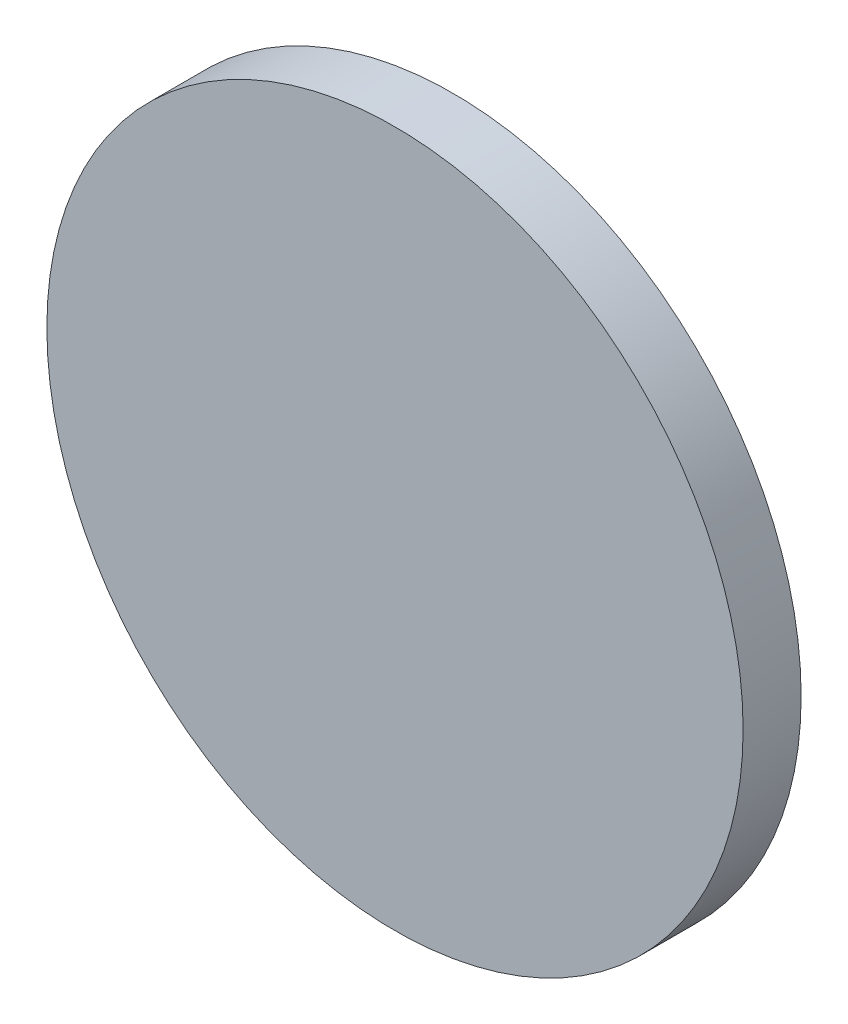
ISO-10303-21;
HEADER;
FILE_DESCRIPTION(('STEP AP214'),'2;1');
FILE_NAME('part.step','',(''),(''),'','','');
FILE_SCHEMA(('AUTOMOTIVE_DESIGN { 1 0 10303 214 1 1 1 1 }'));
ENDSEC;
DATA;
#1=APPLICATION_CONTEXT('core data for automotive mechanical design processes');
#2=APPLICATION_PROTOCOL_DEFINITION('international standard','automotive_design',2000,#1);
#3=PRODUCT_CONTEXT('',#1,'mechanical');
#4=PRODUCT('Part','Part','',(#3));
#5=PRODUCT_RELATED_PRODUCT_CATEGORY('part','',(#4));
#6=PRODUCT_DEFINITION_FORMATION('','',#4);
#7=PRODUCT_DEFINITION_CONTEXT('part definition',#1,'design');
#8=PRODUCT_DEFINITION('design','',#6,#7);
#9=PRODUCT_DEFINITION_SHAPE('','',#8);
#10=(LENGTH_UNIT() NAMED_UNIT(*) SI_UNIT(.MILLI.,.METRE.));
#11=(NAMED_UNIT(*) PLANE_ANGLE_UNIT() SI_UNIT($,.RADIAN.));
#12=(NAMED_UNIT(*) SI_UNIT($,.STERADIAN.) SOLID_ANGLE_UNIT());
#13=UNCERTAINTY_MEASURE_WITH_UNIT(LENGTH_MEASURE(1.E-05),#10,'distance_accuracy_value','');
#14=(GEOMETRIC_REPRESENTATION_CONTEXT(3) GLOBAL_UNCERTAINTY_ASSIGNED_CONTEXT((#13)) GLOBAL_UNIT_ASSIGNED_CONTEXT((#10,
#11,#12)) REPRESENTATION_CONTEXT('',''));
#15=CARTESIAN_POINT('',(0.,0.,0.));
#16=DIRECTION('',(0.,0.,1.));
#17=DIRECTION('',(1.,0.,0.));
#18=AXIS2_PLACEMENT_3D('',#15,#16,#17);
#19=CARTESIAN_POINT('',(0.,0.,0.));
#20=DIRECTION('',(0.,0.,1.));
#21=DIRECTION('',(1.,0.,0.));
#22=AXIS2_PLACEMENT_3D('',#19,#20,#21);
#23=PLANE('',#22);
#24=CARTESIAN_POINT('',(0.,0.,0.));
#25=DIRECTION('',(0.,0.,1.));
#26=DIRECTION('',(1.,0.,0.));
#27=AXIS2_PLACEMENT_3D('',#24,#25,#26);
#28=CIRCLE('',#27,76.2);
#29=CARTESIAN_POINT('',(76.2,0.,0.));
#30=VERTEX_POINT('',#29);
#31=EDGE_CURVE('E55',#30,#30,#28,.T.);
#32=ORIENTED_EDGE('',*,*,#31,.F.);
#33=EDGE_LOOP('',(#32));
#34=FACE_BOUND('',#33,.T.);
#35=ADVANCED_FACE('F51',(#34),#23,.F.);
#36=CARTESIAN_POINT('',(0.,0.,12.7));
#37=DIRECTION('',(0.,0.,-1.));
#38=DIRECTION('',(-1.,0.,0.));
#39=AXIS2_PLACEMENT_3D('',#36,#37,#38);
#40=CYLINDRICAL_SURFACE('',#39,76.2);
#41=CARTESIAN_POINT('',(0.,0.,12.7));
#42=DIRECTION('',(0.,0.,1.));
#43=DIRECTION('',(1.,0.,0.));
#44=AXIS2_PLACEMENT_3D('',#41,#42,#43);
#45=CIRCLE('',#44,76.2);
#46=CARTESIAN_POINT('',(76.2,0.,12.7));
#47=VERTEX_POINT('',#46);
#48=EDGE_CURVE('E11',#47,#47,#45,.T.);
#49=ORIENTED_EDGE('',*,*,#48,.F.);
#50=EDGE_LOOP('',(#49));
#51=FACE_BOUND('',#50,.T.);
#52=ORIENTED_EDGE('',*,*,#31,.T.);
#53=EDGE_LOOP('',(#52));
#54=FACE_BOUND('',#53,.T.);
#55=ADVANCED_FACE('F53',(#51,#54),#40,.T.);
#56=CARTESIAN_POINT('',(0.,0.,12.7));
#57=DIRECTION('',(0.,0.,1.));
#58=DIRECTION('',(1.,0.,0.));
#59=AXIS2_PLACEMENT_3D('',#56,#57,#58);
#60=PLANE('',#59);
#61=ORIENTED_EDGE('',*,*,#48,.T.);
#62=EDGE_LOOP('',(#61));
#63=FACE_BOUND('',#62,.T.);
#64=ADVANCED_FACE('F68',(#63),#60,.T.);
#65=CLOSED_SHELL('',(#35,#55,#64));
#66=MANIFOLD_SOLID_BREP('B2',#65);
#67=ADVANCED_BREP_SHAPE_REPRESENTATION('',(#18,#66),#14);
#68=SHAPE_DEFINITION_REPRESENTATION(#9,#67);
ENDSEC;
END-ISO-10303-21;
